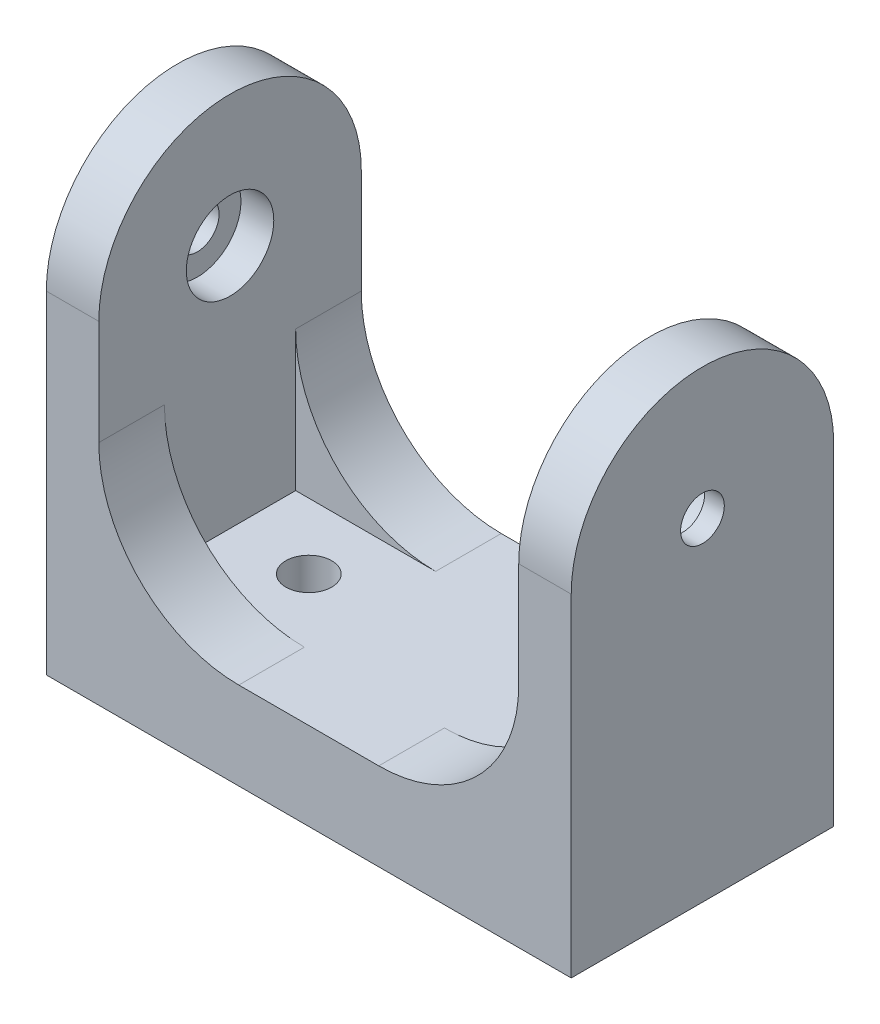
ISO-10303-21;
HEADER;
FILE_DESCRIPTION(('STEP AP214'),'2;1');
FILE_NAME('part.step','',(''),(''),'','','');
FILE_SCHEMA(('AUTOMOTIVE_DESIGN { 1 0 10303 214 1 1 1 1 }'));
ENDSEC;
DATA;
#1=APPLICATION_CONTEXT('core data for automotive mechanical design processes');
#2=APPLICATION_PROTOCOL_DEFINITION('international standard','automotive_design',2000,#1);
#3=PRODUCT_CONTEXT('',#1,'mechanical');
#4=PRODUCT('Part','Part','',(#3));
#5=PRODUCT_RELATED_PRODUCT_CATEGORY('part','',(#4));
#6=PRODUCT_DEFINITION_FORMATION('','',#4);
#7=PRODUCT_DEFINITION_CONTEXT('part definition',#1,'design');
#8=PRODUCT_DEFINITION('design','',#6,#7);
#9=PRODUCT_DEFINITION_SHAPE('','',#8);
#10=(LENGTH_UNIT() NAMED_UNIT(*) SI_UNIT(.MILLI.,.METRE.));
#11=(NAMED_UNIT(*) PLANE_ANGLE_UNIT() SI_UNIT($,.RADIAN.));
#12=(NAMED_UNIT(*) SI_UNIT($,.STERADIAN.) SOLID_ANGLE_UNIT());
#13=UNCERTAINTY_MEASURE_WITH_UNIT(LENGTH_MEASURE(1.E-05),#10,'distance_accuracy_value','');
#14=(GEOMETRIC_REPRESENTATION_CONTEXT(3) GLOBAL_UNCERTAINTY_ASSIGNED_CONTEXT((#13)) GLOBAL_UNIT_ASSIGNED_CONTEXT((#10,
#11,#12)) REPRESENTATION_CONTEXT('',''));
#15=CARTESIAN_POINT('',(0.,0.,0.));
#16=DIRECTION('',(0.,0.,1.));
#17=DIRECTION('',(1.,0.,0.));
#18=AXIS2_PLACEMENT_3D('',#15,#16,#17);
#19=CARTESIAN_POINT('',(68.58,48.26,-19.05));
#20=DIRECTION('',(1.,0.,0.));
#21=DIRECTION('',(0.,0.,-1.));
#22=AXIS2_PLACEMENT_3D('',#19,#20,#21);
#23=CYLINDRICAL_SURFACE('',#22,3.175);
#24=CARTESIAN_POINT('',(76.2,48.26,-19.05));
#25=DIRECTION('',(-1.,0.,0.));
#26=DIRECTION('',(0.,0.,1.));
#27=AXIS2_PLACEMENT_3D('',#24,#25,#26);
#28=CIRCLE('',#27,3.175);
#29=CARTESIAN_POINT('',(76.2000000000001,48.26,-22.225));
#30=VERTEX_POINT('',#29);
#31=EDGE_CURVE('E196',#30,#30,#28,.T.);
#32=CARTESIAN_POINT('',(73.3425,48.26,-19.05));
#33=DIRECTION('',(-1.,0.,0.));
#34=DIRECTION('',(0.,0.,1.));
#35=AXIS2_PLACEMENT_3D('',#32,#33,#34);
#36=CIRCLE('',#35,3.175);
#37=CARTESIAN_POINT('',(73.3425,48.26,-22.225));
#38=VERTEX_POINT('',#37);
#39=EDGE_CURVE('E45',#38,#38,#36,.T.);
#40=CARTESIAN_POINT('',(76.2000000000001,48.26,-22.225));
#41=CARTESIAN_POINT('',(76.1702343750001,48.26,-22.225));
#42=CARTESIAN_POINT('',(76.1404687500001,48.26,-22.225));
#43=CARTESIAN_POINT('',(76.0809375000001,48.26,-22.225));
#44=CARTESIAN_POINT('',(76.0511718750001,48.26,-22.225));
#45=CARTESIAN_POINT('',(75.991640625,48.26,-22.225));
#46=CARTESIAN_POINT('',(75.961875,48.26,-22.225));
#47=CARTESIAN_POINT('',(75.9023437500001,48.26,-22.225));
#48=CARTESIAN_POINT('',(75.872578125,48.26,-22.225));
#49=CARTESIAN_POINT('',(75.8130468750001,48.26,-22.225));
#50=CARTESIAN_POINT('',(75.7832812500001,48.26,-22.225));
#51=CARTESIAN_POINT('',(75.7237500000001,48.26,-22.225));
#52=CARTESIAN_POINT('',(75.6939843750001,48.26,-22.225));
#53=CARTESIAN_POINT('',(75.6344531250001,48.26,-22.225));
#54=CARTESIAN_POINT('',(75.6046875,48.26,-22.225));
#55=CARTESIAN_POINT('',(75.54515625,48.26,-22.225));
#56=CARTESIAN_POINT('',(75.5153906250001,48.26,-22.225));
#57=CARTESIAN_POINT('',(75.4558593750001,48.26,-22.225));
#58=CARTESIAN_POINT('',(75.42609375,48.26,-22.225));
#59=CARTESIAN_POINT('',(75.3665625000001,48.26,-22.225));
#60=CARTESIAN_POINT('',(75.3367968750001,48.26,-22.225));
#61=CARTESIAN_POINT('',(75.2772656250001,48.26,-22.225));
#62=CARTESIAN_POINT('',(75.2475,48.26,-22.225));
#63=CARTESIAN_POINT('',(75.1879687500001,48.26,-22.225));
#64=CARTESIAN_POINT('',(75.158203125,48.26,-22.225));
#65=CARTESIAN_POINT('',(75.0986718750001,48.26,-22.225));
#66=CARTESIAN_POINT('',(75.0689062500001,48.26,-22.225));
#67=CARTESIAN_POINT('',(75.0093750000001,48.26,-22.225));
#68=CARTESIAN_POINT('',(74.9796093750001,48.26,-22.225));
#69=CARTESIAN_POINT('',(74.920078125,48.26,-22.225));
#70=CARTESIAN_POINT('',(74.8903125000001,48.26,-22.225));
#71=CARTESIAN_POINT('',(74.8307812500001,48.26,-22.225));
#72=CARTESIAN_POINT('',(74.801015625,48.26,-22.225));
#73=CARTESIAN_POINT('',(74.7414843750001,48.26,-22.225));
#74=CARTESIAN_POINT('',(74.71171875,48.26,-22.225));
#75=CARTESIAN_POINT('',(74.6521875000001,48.26,-22.225));
#76=CARTESIAN_POINT('',(74.6224218750001,48.26,-22.225));
#77=CARTESIAN_POINT('',(74.5628906250001,48.26,-22.225));
#78=CARTESIAN_POINT('',(74.533125,48.26,-22.225));
#79=CARTESIAN_POINT('',(74.47359375,48.26,-22.225));
#80=CARTESIAN_POINT('',(74.4438281250001,48.26,-22.225));
#81=CARTESIAN_POINT('',(74.3842968750001,48.26,-22.225));
#82=CARTESIAN_POINT('',(74.3545312500001,48.26,-22.225));
#83=CARTESIAN_POINT('',(74.2950000000001,48.26,-22.225));
#84=CARTESIAN_POINT('',(74.265234375,48.26,-22.225));
#85=CARTESIAN_POINT('',(74.2057031250001,48.26,-22.225));
#86=CARTESIAN_POINT('',(74.1759375,48.26,-22.225));
#87=CARTESIAN_POINT('',(74.1164062500001,48.26,-22.225));
#88=CARTESIAN_POINT('',(74.086640625,48.26,-22.225));
#89=CARTESIAN_POINT('',(74.0271093750001,48.26,-22.225));
#90=CARTESIAN_POINT('',(73.9973437500001,48.26,-22.225));
#91=CARTESIAN_POINT('',(73.9378125000001,48.26,-22.225));
#92=CARTESIAN_POINT('',(73.9080468750001,48.26,-22.225));
#93=CARTESIAN_POINT('',(73.8485156250001,48.26,-22.225));
#94=CARTESIAN_POINT('',(73.8187500000001,48.26,-22.225));
#95=CARTESIAN_POINT('',(73.75921875,48.26,-22.225));
#96=CARTESIAN_POINT('',(73.729453125,48.26,-22.225));
#97=CARTESIAN_POINT('',(73.6699218750001,48.26,-22.225));
#98=CARTESIAN_POINT('',(73.64015625,48.26,-22.225));
#99=CARTESIAN_POINT('',(73.5806250000001,48.26,-22.225));
#100=CARTESIAN_POINT('',(73.5508593750001,48.26,-22.225));
#101=CARTESIAN_POINT('',(73.4913281250001,48.26,-22.225));
#102=CARTESIAN_POINT('',(73.4615625000001,48.26,-22.225));
#103=CARTESIAN_POINT('',(73.4020312500001,48.26,-22.225));
#104=CARTESIAN_POINT('',(73.372265625,48.26,-22.225));
#105=CARTESIAN_POINT('',(73.3425,48.26,-22.225));
#106=B_SPLINE_CURVE_WITH_KNOTS('',3,(#40,#41,#42,#43,#44,#45,#46,#47,#48,#49,#50,#51,#52,#53,
#54,#55,#56,#57,#58,#59,#60,#61,#62,#63,#64,#65,#66,#67,#68,#69,#70,#71,#72,#73,#74,#75,#76,#77,
#78,#79,#80,#81,#82,#83,#84,#85,#86,#87,#88,#89,#90,#91,#92,#93,#94,#95,#96,#97,#98,#99,#100,
#101,#102,#103,#104,#105),.UNSPECIFIED.,.F.,.F.,(4,2,2,2,2,2,2,2,2,2,2,2,2,2,2,2,2,2,2,2,2,2,2,
2,2,2,2,2,2,2,2,2,4),(0.,0.0892968750000056,0.178593750000011,0.267890625000003,
0.357187500000009,0.446484375,0.535781250000006,0.625078125000011,0.714375000000003,
0.803671875000009,0.892968750000001,0.982265625000006,1.07156250000001,1.160859375,
1.25015625000001,1.339453125,1.42875000000001,1.51804687500001,1.60734375,1.69664062500001,
1.7859375,1.87523437500001,1.96453125000001,2.053828125,2.14312500000001,2.232421875,
2.32171875000001,2.41101562500001,2.5003125,2.58960937500001,2.67890625,2.76820312500001,
2.85750000000001),.UNSPECIFIED.);
#107=EDGE_CURVE('BSEAM41',#30,#38,#106,.T.);
#108=ORIENTED_EDGE('',*,*,#31,.F.);
#109=ORIENTED_EDGE('',*,*,#39,.T.);
#110=ORIENTED_EDGE('',*,*,#107,.T.);
#111=ORIENTED_EDGE('',*,*,#107,.F.);
#112=EDGE_LOOP('',(#108,#110,#109,#111));
#113=FACE_BOUND('',#112,.T.);
#114=ADVANCED_FACE('F41',(#113),#23,.F.);
#115=CARTESIAN_POINT('',(57.15,12.7,-19.05));
#116=DIRECTION('',(0.,-1.,0.));
#117=DIRECTION('',(0.,0.,-1.));
#118=AXIS2_PLACEMENT_3D('',#115,#116,#117);
#119=CYLINDRICAL_SURFACE('',#118,3.3274);
#120=CARTESIAN_POINT('',(57.15,0.,-19.05));
#121=DIRECTION('',(0.,1.,0.));
#122=DIRECTION('',(0.,0.,-1.));
#123=AXIS2_PLACEMENT_3D('',#120,#121,#122);
#124=CIRCLE('',#123,3.3274);
#125=CARTESIAN_POINT('',(57.15,0.,-22.3774));
#126=VERTEX_POINT('',#125);
#127=EDGE_CURVE('E274',#126,#126,#124,.T.);
#128=ORIENTED_EDGE('',*,*,#127,.F.);
#129=EDGE_LOOP('',(#128));
#130=FACE_BOUND('',#129,.T.);
#131=CARTESIAN_POINT('',(57.15,12.7,-19.05));
#132=DIRECTION('',(0.,1.,0.));
#133=DIRECTION('',(0.,0.,1.));
#134=AXIS2_PLACEMENT_3D('',#131,#132,#133);
#135=CIRCLE('',#134,3.3274);
#136=CARTESIAN_POINT('',(57.15,12.7,-15.7226));
#137=VERTEX_POINT('',#136);
#138=EDGE_CURVE('E169',#137,#137,#135,.T.);
#139=ORIENTED_EDGE('',*,*,#138,.T.);
#140=EDGE_LOOP('',(#139));
#141=FACE_BOUND('',#140,.T.);
#142=ADVANCED_FACE('F403',(#130,#141),#119,.F.);
#143=CARTESIAN_POINT('',(48.26,33.02,-19.05));
#144=DIRECTION('',(0.,0.,-1.));
#145=DIRECTION('',(-1.,0.,0.));
#146=AXIS2_PLACEMENT_3D('',#143,#144,#145);
#147=CYLINDRICAL_SURFACE('',#146,20.32);
#148=DIRECTION('',(0.,0.,1.));
#149=VECTOR('',#148,1.);
#150=CARTESIAN_POINT('',(48.26,12.7,-38.1));
#151=LINE('',#150,#149);
#152=CARTESIAN_POINT('',(48.26,12.7,-28.575));
#153=VERTEX_POINT('',#152);
#154=CARTESIAN_POINT('',(48.26,12.7,-38.1));
#155=VERTEX_POINT('',#154);
#156=EDGE_CURVE('E350',#153,#155,#151,.F.);
#157=ORIENTED_EDGE('',*,*,#156,.F.);
#158=CARTESIAN_POINT('',(48.26,33.02,-28.575));
#159=DIRECTION('',(0.,0.,-1.));
#160=DIRECTION('',(-1.,0.,0.));
#161=AXIS2_PLACEMENT_3D('',#158,#159,#160);
#162=CIRCLE('',#161,20.32);
#163=CARTESIAN_POINT('',(68.58,33.02,-28.575));
#164=VERTEX_POINT('',#163);
#165=EDGE_CURVE('E11',#153,#164,#162,.F.);
#166=ORIENTED_EDGE('',*,*,#165,.T.);
#167=DIRECTION('',(0.,0.,1.));
#168=VECTOR('',#167,1.);
#169=CARTESIAN_POINT('',(68.58,33.02,0.));
#170=LINE('',#169,#168);
#171=CARTESIAN_POINT('',(68.58,33.02,-38.1));
#172=VERTEX_POINT('',#171);
#173=EDGE_CURVE('E166',#172,#164,#170,.T.);
#174=ORIENTED_EDGE('',*,*,#173,.F.);
#175=CARTESIAN_POINT('',(48.26,33.02,-38.1));
#176=DIRECTION('',(0.,0.,1.));
#177=DIRECTION('',(1.,0.,0.));
#178=AXIS2_PLACEMENT_3D('',#175,#176,#177);
#179=CIRCLE('',#178,20.32);
#180=EDGE_CURVE('E356',#155,#172,#179,.T.);
#181=ORIENTED_EDGE('',*,*,#180,.F.);
#182=EDGE_LOOP('',(#157,#166,#174,#181));
#183=FACE_BOUND('',#182,.T.);
#184=ADVANCED_FACE('F401',(#183),#147,.F.);
#185=CARTESIAN_POINT('',(0.,12.7,0.));
#186=DIRECTION('',(0.,-1.,0.));
#187=DIRECTION('',(0.,0.,-1.));
#188=AXIS2_PLACEMENT_3D('',#185,#186,#187);
#189=PLANE('',#188);
#190=DIRECTION('',(1.,0.,0.));
#191=VECTOR('',#190,1.);
#192=CARTESIAN_POINT('',(68.58,12.7,-28.575));
#193=LINE('',#192,#191);
#194=CARTESIAN_POINT('',(68.58,12.7,-28.575));
#195=VERTEX_POINT('',#194);
#196=EDGE_CURVE('E58',#153,#195,#193,.T.);
#197=ORIENTED_EDGE('',*,*,#196,.F.);
#198=ORIENTED_EDGE('',*,*,#156,.T.);
#199=DIRECTION('',(-1.,0.,0.));
#200=VECTOR('',#199,1.);
#201=CARTESIAN_POINT('',(0.,12.7,-38.1));
#202=LINE('',#201,#200);
#203=CARTESIAN_POINT('',(27.94,12.7,-38.1));
#204=VERTEX_POINT('',#203);
#205=EDGE_CURVE('E289',#155,#204,#202,.T.);
#206=ORIENTED_EDGE('',*,*,#205,.T.);
#207=DIRECTION('',(0.,0.,1.));
#208=VECTOR('',#207,1.);
#209=CARTESIAN_POINT('',(27.94,12.7,0.));
#210=LINE('',#209,#208);
#211=CARTESIAN_POINT('',(27.94,12.7,-28.575));
#212=VERTEX_POINT('',#211);
#213=EDGE_CURVE('E321',#204,#212,#210,.T.);
#214=ORIENTED_EDGE('',*,*,#213,.T.);
#215=DIRECTION('',(-1.,0.,0.));
#216=VECTOR('',#215,1.);
#217=CARTESIAN_POINT('',(7.62,12.7,-28.575));
#218=LINE('',#217,#216);
#219=CARTESIAN_POINT('',(7.62,12.7,-28.575));
#220=VERTEX_POINT('',#219);
#221=EDGE_CURVE('E237',#212,#220,#218,.T.);
#222=ORIENTED_EDGE('',*,*,#221,.T.);
#223=DIRECTION('',(0.,0.,1.));
#224=VECTOR('',#223,1.);
#225=CARTESIAN_POINT('',(7.62,12.7,-28.575));
#226=LINE('',#225,#224);
#227=CARTESIAN_POINT('',(7.62,12.7,-9.525));
#228=VERTEX_POINT('',#227);
#229=EDGE_CURVE('E230',#220,#228,#226,.T.);
#230=ORIENTED_EDGE('',*,*,#229,.T.);
#231=DIRECTION('',(1.,0.,0.));
#232=VECTOR('',#231,1.);
#233=CARTESIAN_POINT('',(7.62,12.7,-9.525));
#234=LINE('',#233,#232);
#235=CARTESIAN_POINT('',(27.94,12.7,-9.525));
#236=VERTEX_POINT('',#235);
#237=EDGE_CURVE('E234',#228,#236,#234,.T.);
#238=ORIENTED_EDGE('',*,*,#237,.T.);
#239=CARTESIAN_POINT('',(27.94,12.7,0.));
#240=VERTEX_POINT('',#239);
#241=EDGE_CURVE('E320',#236,#240,#210,.T.);
#242=ORIENTED_EDGE('',*,*,#241,.T.);
#243=DIRECTION('',(1.,0.,0.));
#244=VECTOR('',#243,1.);
#245=CARTESIAN_POINT('',(0.,12.7,0.));
#246=LINE('',#245,#244);
#247=CARTESIAN_POINT('',(48.26,12.7,0.));
#248=VERTEX_POINT('',#247);
#249=EDGE_CURVE('E286',#240,#248,#246,.T.);
#250=ORIENTED_EDGE('',*,*,#249,.T.);
#251=CARTESIAN_POINT('',(48.26,12.7,-9.525));
#252=VERTEX_POINT('',#251);
#253=EDGE_CURVE('E351',#248,#252,#151,.F.);
#254=ORIENTED_EDGE('',*,*,#253,.T.);
#255=DIRECTION('',(-1.,0.,0.));
#256=VECTOR('',#255,1.);
#257=CARTESIAN_POINT('',(68.58,12.7,-9.525));
#258=LINE('',#257,#256);
#259=CARTESIAN_POINT('',(68.58,12.7,-9.525));
#260=VERTEX_POINT('',#259);
#261=EDGE_CURVE('E175',#260,#252,#258,.T.);
#262=ORIENTED_EDGE('',*,*,#261,.F.);
#263=DIRECTION('',(0.,0.,1.));
#264=VECTOR('',#263,1.);
#265=CARTESIAN_POINT('',(68.58,12.7,-28.575));
#266=LINE('',#265,#264);
#267=EDGE_CURVE('E162',#195,#260,#266,.T.);
#268=ORIENTED_EDGE('',*,*,#267,.F.);
#269=EDGE_LOOP('',(#197,#198,#206,#214,#222,#230,#238,#242,#250,#254,#262,#268));
#270=FACE_BOUND('',#269,.T.);
#271=CARTESIAN_POINT('',(19.05,12.7,-19.05));
#272=DIRECTION('',(0.,1.,0.));
#273=DIRECTION('',(0.,0.,1.));
#274=AXIS2_PLACEMENT_3D('',#271,#272,#273);
#275=CIRCLE('',#274,3.3274);
#276=CARTESIAN_POINT('',(19.05,12.7,-15.7226));
#277=VERTEX_POINT('',#276);
#278=EDGE_CURVE('E247',#277,#277,#275,.T.);
#279=ORIENTED_EDGE('',*,*,#278,.F.);
#280=EDGE_LOOP('',(#279));
#281=FACE_BOUND('',#280,.T.);
#282=ORIENTED_EDGE('',*,*,#138,.F.);
#283=EDGE_LOOP('',(#282));
#284=FACE_BOUND('',#283,.T.);
#285=ADVANCED_FACE('F177',(#270,#281,#284),#189,.F.);
#286=CARTESIAN_POINT('',(7.62,48.26,-19.05));
#287=DIRECTION('',(-1.,0.,0.));
#288=DIRECTION('',(0.,0.,1.));
#289=AXIS2_PLACEMENT_3D('',#286,#287,#288);
#290=CYLINDRICAL_SURFACE('',#289,3.175);
#291=CARTESIAN_POINT('',(0.,48.26,-19.05));
#292=DIRECTION('',(-1.,0.,0.));
#293=DIRECTION('',(0.,0.,1.));
#294=AXIS2_PLACEMENT_3D('',#291,#292,#293);
#295=CIRCLE('',#294,3.175);
#296=CARTESIAN_POINT('',(0.,48.26,-15.875));
#297=VERTEX_POINT('',#296);
#298=EDGE_CURVE('E251',#297,#297,#295,.T.);
#299=CARTESIAN_POINT('',(2.8575,48.26,-19.05));
#300=DIRECTION('',(1.,0.,0.));
#301=DIRECTION('',(0.,0.,-1.));
#302=AXIS2_PLACEMENT_3D('',#299,#300,#301);
#303=CIRCLE('',#302,3.175);
#304=CARTESIAN_POINT('',(2.8575,48.26,-15.875));
#305=VERTEX_POINT('',#304);
#306=EDGE_CURVE('E226',#305,#305,#303,.F.);
#307=CARTESIAN_POINT('',(0.,48.26,-15.875));
#308=CARTESIAN_POINT('',(0.0297656250000001,48.26,-15.875));
#309=CARTESIAN_POINT('',(0.0595312500000003,48.26,-15.875));
#310=CARTESIAN_POINT('',(0.1190625,48.26,-15.875));
#311=CARTESIAN_POINT('',(0.148828125,48.26,-15.875));
#312=CARTESIAN_POINT('',(0.208359375,48.26,-15.875));
#313=CARTESIAN_POINT('',(0.238125,48.26,-15.875));
#314=CARTESIAN_POINT('',(0.29765625,48.26,-15.875));
#315=CARTESIAN_POINT('',(0.327421875,48.26,-15.875));
#316=CARTESIAN_POINT('',(0.386953125,48.26,-15.875));
#317=CARTESIAN_POINT('',(0.41671875,48.26,-15.875));
#318=CARTESIAN_POINT('',(0.47625,48.26,-15.875));
#319=CARTESIAN_POINT('',(0.506015625,48.26,-15.875));
#320=CARTESIAN_POINT('',(0.565546875,48.26,-15.875));
#321=CARTESIAN_POINT('',(0.595312499999999,48.26,-15.875));
#322=CARTESIAN_POINT('',(0.65484375,48.26,-15.875));
#323=CARTESIAN_POINT('',(0.684609375,48.26,-15.875));
#324=CARTESIAN_POINT('',(0.744140625,48.26,-15.875));
#325=CARTESIAN_POINT('',(0.77390625,48.26,-15.875));
#326=CARTESIAN_POINT('',(0.8334375,48.26,-15.875));
#327=CARTESIAN_POINT('',(0.863203125,48.26,-15.875));
#328=CARTESIAN_POINT('',(0.922734375,48.26,-15.875));
#329=CARTESIAN_POINT('',(0.952499999999999,48.26,-15.875));
#330=CARTESIAN_POINT('',(1.01203125,48.26,-15.875));
#331=CARTESIAN_POINT('',(1.041796875,48.26,-15.875));
#332=CARTESIAN_POINT('',(1.101328125,48.26,-15.875));
#333=CARTESIAN_POINT('',(1.13109375,48.26,-15.875));
#334=CARTESIAN_POINT('',(1.190625,48.26,-15.875));
#335=CARTESIAN_POINT('',(1.220390625,48.26,-15.875));
#336=CARTESIAN_POINT('',(1.279921875,48.26,-15.875));
#337=CARTESIAN_POINT('',(1.3096875,48.26,-15.875));
#338=CARTESIAN_POINT('',(1.36921875,48.26,-15.875));
#339=CARTESIAN_POINT('',(1.398984375,48.26,-15.875));
#340=CARTESIAN_POINT('',(1.458515625,48.26,-15.875));
#341=CARTESIAN_POINT('',(1.48828125,48.26,-15.875));
#342=CARTESIAN_POINT('',(1.5478125,48.26,-15.875));
#343=CARTESIAN_POINT('',(1.577578125,48.26,-15.875));
#344=CARTESIAN_POINT('',(1.637109375,48.26,-15.875));
#345=CARTESIAN_POINT('',(1.666875,48.26,-15.875));
#346=CARTESIAN_POINT('',(1.72640625,48.26,-15.875));
#347=CARTESIAN_POINT('',(1.756171875,48.26,-15.875));
#348=CARTESIAN_POINT('',(1.815703125,48.26,-15.875));
#349=CARTESIAN_POINT('',(1.84546875,48.26,-15.875));
#350=CARTESIAN_POINT('',(1.905,48.26,-15.875));
#351=CARTESIAN_POINT('',(1.934765625,48.26,-15.875));
#352=CARTESIAN_POINT('',(1.994296875,48.26,-15.875));
#353=CARTESIAN_POINT('',(2.0240625,48.26,-15.875));
#354=CARTESIAN_POINT('',(2.08359375,48.26,-15.875));
#355=CARTESIAN_POINT('',(2.113359375,48.26,-15.875));
#356=CARTESIAN_POINT('',(2.172890625,48.26,-15.875));
#357=CARTESIAN_POINT('',(2.20265625,48.26,-15.875));
#358=CARTESIAN_POINT('',(2.2621875,48.26,-15.875));
#359=CARTESIAN_POINT('',(2.291953125,48.26,-15.875));
#360=CARTESIAN_POINT('',(2.351484375,48.26,-15.875));
#361=CARTESIAN_POINT('',(2.38125,48.26,-15.875));
#362=CARTESIAN_POINT('',(2.44078125,48.26,-15.875));
#363=CARTESIAN_POINT('',(2.470546875,48.26,-15.875));
#364=CARTESIAN_POINT('',(2.530078125,48.26,-15.875));
#365=CARTESIAN_POINT('',(2.55984375,48.26,-15.875));
#366=CARTESIAN_POINT('',(2.619375,48.26,-15.875));
#367=CARTESIAN_POINT('',(2.649140625,48.26,-15.875));
#368=CARTESIAN_POINT('',(2.708671875,48.26,-15.875));
#369=CARTESIAN_POINT('',(2.7384375,48.26,-15.875));
#370=CARTESIAN_POINT('',(2.79796875,48.26,-15.875));
#371=CARTESIAN_POINT('',(2.827734375,48.26,-15.875));
#372=CARTESIAN_POINT('',(2.8575,48.26,-15.875));
#373=B_SPLINE_CURVE_WITH_KNOTS('',3,(#307,#308,#309,#310,#311,#312,#313,#314,#315,#316,#317,
#318,#319,#320,#321,#322,#323,#324,#325,#326,#327,#328,#329,#330,#331,#332,#333,#334,#335,#336,
#337,#338,#339,#340,#341,#342,#343,#344,#345,#346,#347,#348,#349,#350,#351,#352,#353,#354,#355,
#356,#357,#358,#359,#360,#361,#362,#363,#364,#365,#366,#367,#368,#369,#370,#371,#372),
.UNSPECIFIED.,.F.,.F.,(4,2,2,2,2,2,2,2,2,2,2,2,2,2,2,2,2,2,2,2,2,2,2,2,2,2,2,2,2,2,2,2,4),(0.,
0.0892968750000004,0.17859375,0.267890624999999,0.3571875,0.446484375,0.53578125,
0.625078124999999,0.714375,0.803671875,0.89296875,0.982265624999999,1.0715625,1.160859375,
1.25015625,1.339453125,1.42875,1.518046875,1.60734375,1.696640625,1.7859375,1.875234375,
1.96453125,2.053828125,2.143125,2.232421875,2.32171875,2.411015625,2.5003125,2.589609375,
2.67890625,2.768203125,2.8575),.UNSPECIFIED.);
#374=EDGE_CURVE('BSEAM408',#297,#305,#373,.T.);
#375=ORIENTED_EDGE('',*,*,#298,.T.);
#376=ORIENTED_EDGE('',*,*,#306,.F.);
#377=ORIENTED_EDGE('',*,*,#374,.T.);
#378=ORIENTED_EDGE('',*,*,#374,.F.);
#379=EDGE_LOOP('',(#375,#377,#376,#378));
#380=FACE_BOUND('',#379,.T.);
#381=ADVANCED_FACE('F408',(#380),#290,.F.);
#382=CARTESIAN_POINT('',(19.05,12.7,-19.05));
#383=DIRECTION('',(0.,-1.,0.));
#384=DIRECTION('',(0.,0.,-1.));
#385=AXIS2_PLACEMENT_3D('',#382,#383,#384);
#386=CYLINDRICAL_SURFACE('',#385,3.3274);
#387=CARTESIAN_POINT('',(19.05,0.,-19.05));
#388=DIRECTION('',(0.,1.,0.));
#389=DIRECTION('',(0.,0.,1.));
#390=AXIS2_PLACEMENT_3D('',#387,#388,#389);
#391=CIRCLE('',#390,3.3274);
#392=CARTESIAN_POINT('',(19.05,0.,-15.7226));
#393=VERTEX_POINT('',#392);
#394=EDGE_CURVE('E281',#393,#393,#391,.T.);
#395=ORIENTED_EDGE('',*,*,#394,.F.);
#396=EDGE_LOOP('',(#395));
#397=FACE_BOUND('',#396,.T.);
#398=ORIENTED_EDGE('',*,*,#278,.T.);
#399=EDGE_LOOP('',(#398));
#400=FACE_BOUND('',#399,.T.);
#401=ADVANCED_FACE('F444',(#397,#400),#386,.F.);
#402=CARTESIAN_POINT('',(27.94,33.02,0.));
#403=DIRECTION('',(0.,0.,-1.));
#404=DIRECTION('',(-1.,0.,0.));
#405=AXIS2_PLACEMENT_3D('',#402,#403,#404);
#406=CYLINDRICAL_SURFACE('',#405,20.32);
#407=CARTESIAN_POINT('',(27.94,33.02,-9.525));
#408=DIRECTION('',(0.,0.,-1.));
#409=DIRECTION('',(-1.,0.,0.));
#410=AXIS2_PLACEMENT_3D('',#407,#408,#409);
#411=CIRCLE('',#410,20.32);
#412=CARTESIAN_POINT('',(7.62000000000001,33.02,-9.525));
#413=VERTEX_POINT('',#412);
#414=EDGE_CURVE('E340',#413,#236,#411,.F.);
#415=ORIENTED_EDGE('',*,*,#414,.F.);
#416=DIRECTION('',(0.,0.,1.));
#417=VECTOR('',#416,1.);
#418=CARTESIAN_POINT('',(7.62,33.02,-38.1));
#419=LINE('',#418,#417);
#420=CARTESIAN_POINT('',(7.62,33.02,0.));
#421=VERTEX_POINT('',#420);
#422=EDGE_CURVE('E326',#421,#413,#419,.F.);
#423=ORIENTED_EDGE('',*,*,#422,.F.);
#424=CARTESIAN_POINT('',(27.94,33.02,0.));
#425=DIRECTION('',(0.,0.,-1.));
#426=DIRECTION('',(-1.,0.,0.));
#427=AXIS2_PLACEMENT_3D('',#424,#425,#426);
#428=CIRCLE('',#427,20.32);
#429=EDGE_CURVE('E330',#240,#421,#428,.T.);
#430=ORIENTED_EDGE('',*,*,#429,.F.);
#431=ORIENTED_EDGE('',*,*,#241,.F.);
#432=EDGE_LOOP('',(#415,#423,#430,#431));
#433=FACE_BOUND('',#432,.T.);
#434=ADVANCED_FACE('F377',(#433),#406,.F.);
#435=CARTESIAN_POINT('',(27.94,33.02,-28.575));
#436=DIRECTION('',(0.,0.,1.));
#437=DIRECTION('',(1.,0.,0.));
#438=AXIS2_PLACEMENT_3D('',#435,#436,#437);
#439=CIRCLE('',#438,20.32);
#440=CARTESIAN_POINT('',(7.62000000000001,33.02,-28.575));
#441=VERTEX_POINT('',#440);
#442=EDGE_CURVE('E337',#212,#441,#439,.F.);
#443=ORIENTED_EDGE('',*,*,#442,.F.);
#444=ORIENTED_EDGE('',*,*,#213,.F.);
#445=CARTESIAN_POINT('',(27.94,33.02,-38.1));
#446=DIRECTION('',(0.,0.,1.));
#447=DIRECTION('',(1.,0.,0.));
#448=AXIS2_PLACEMENT_3D('',#445,#446,#447);
#449=CIRCLE('',#448,20.32);
#450=CARTESIAN_POINT('',(7.62,33.02,-38.1));
#451=VERTEX_POINT('',#450);
#452=EDGE_CURVE('E333',#451,#204,#449,.T.);
#453=ORIENTED_EDGE('',*,*,#452,.F.);
#454=EDGE_CURVE('E325',#441,#451,#419,.F.);
#455=ORIENTED_EDGE('',*,*,#454,.F.);
#456=EDGE_LOOP('',(#443,#444,#453,#455));
#457=FACE_BOUND('',#456,.T.);
#458=ADVANCED_FACE('F389',(#457),#406,.F.);
#459=CARTESIAN_POINT('',(0.,0.,0.));
#460=DIRECTION('',(0.,-1.,0.));
#461=DIRECTION('',(0.,0.,-1.));
#462=AXIS2_PLACEMENT_3D('',#459,#460,#461);
#463=PLANE('',#462);
#464=ORIENTED_EDGE('',*,*,#394,.T.);
#465=EDGE_LOOP('',(#464));
#466=FACE_BOUND('',#465,.T.);
#467=DIRECTION('',(0.,0.,1.));
#468=VECTOR('',#467,1.);
#469=CARTESIAN_POINT('',(0.,0.,0.));
#470=LINE('',#469,#468);
#471=CARTESIAN_POINT('',(0.,0.,-38.1));
#472=VERTEX_POINT('',#471);
#473=CARTESIAN_POINT('',(0.,0.,0.));
#474=VERTEX_POINT('',#473);
#475=EDGE_CURVE('E285',#472,#474,#470,.T.);
#476=ORIENTED_EDGE('',*,*,#475,.F.);
#477=DIRECTION('',(-1.,0.,0.));
#478=VECTOR('',#477,1.);
#479=CARTESIAN_POINT('',(0.,0.,-38.1));
#480=LINE('',#479,#478);
#481=CARTESIAN_POINT('',(76.2,0.,-38.1));
#482=VERTEX_POINT('',#481);
#483=EDGE_CURVE('E290',#482,#472,#480,.T.);
#484=ORIENTED_EDGE('',*,*,#483,.F.);
#485=DIRECTION('',(0.,0.,-1.));
#486=VECTOR('',#485,1.);
#487=CARTESIAN_POINT('',(76.2,0.,0.));
#488=LINE('',#487,#486);
#489=CARTESIAN_POINT('',(76.2,0.,0.));
#490=VERTEX_POINT('',#489);
#491=EDGE_CURVE('E300',#490,#482,#488,.T.);
#492=ORIENTED_EDGE('',*,*,#491,.F.);
#493=DIRECTION('',(1.,0.,0.));
#494=VECTOR('',#493,1.);
#495=CARTESIAN_POINT('',(0.,0.,0.));
#496=LINE('',#495,#494);
#497=EDGE_CURVE('E297',#474,#490,#496,.T.);
#498=ORIENTED_EDGE('',*,*,#497,.F.);
#499=EDGE_LOOP('',(#476,#484,#492,#498));
#500=FACE_BOUND('',#499,.T.);
#501=ORIENTED_EDGE('',*,*,#127,.T.);
#502=EDGE_LOOP('',(#501));
#503=FACE_BOUND('',#502,.T.);
#504=ADVANCED_FACE('F456',(#466,#500,#503),#463,.T.);
#505=CARTESIAN_POINT('',(0.,12.7,0.));
#506=DIRECTION('',(1.,0.,0.));
#507=DIRECTION('',(0.,0.,-1.));
#508=AXIS2_PLACEMENT_3D('',#505,#506,#507);
#509=PLANE('',#508);
#510=ORIENTED_EDGE('',*,*,#475,.T.);
#511=DIRECTION('',(0.,-1.,0.));
#512=VECTOR('',#511,1.);
#513=CARTESIAN_POINT('',(0.,12.7,0.));
#514=LINE('',#513,#512);
#515=CARTESIAN_POINT('',(0.,48.26,0.));
#516=VERTEX_POINT('',#515);
#517=EDGE_CURVE('E316',#516,#474,#514,.T.);
#518=ORIENTED_EDGE('',*,*,#517,.F.);
#519=CARTESIAN_POINT('',(0.,48.26,-19.05));
#520=DIRECTION('',(-1.,0.,0.));
#521=DIRECTION('',(0.,0.,1.));
#522=AXIS2_PLACEMENT_3D('',#519,#520,#521);
#523=CIRCLE('',#522,19.05);
#524=CARTESIAN_POINT('',(0.,48.26,-38.1));
#525=VERTEX_POINT('',#524);
#526=EDGE_CURVE('E255',#516,#525,#523,.T.);
#527=ORIENTED_EDGE('',*,*,#526,.T.);
#528=DIRECTION('',(0.,-1.,0.));
#529=VECTOR('',#528,1.);
#530=CARTESIAN_POINT('',(0.,12.7,-38.1));
#531=LINE('',#530,#529);
#532=EDGE_CURVE('E293',#525,#472,#531,.T.);
#533=ORIENTED_EDGE('',*,*,#532,.T.);
#534=EDGE_LOOP('',(#510,#518,#527,#533));
#535=FACE_BOUND('',#534,.T.);
#536=ORIENTED_EDGE('',*,*,#298,.F.);
#537=EDGE_LOOP('',(#536));
#538=FACE_BOUND('',#537,.T.);
#539=ADVANCED_FACE('F459',(#535,#538),#509,.F.);
#540=CARTESIAN_POINT('',(0.,12.7,0.));
#541=DIRECTION('',(0.,0.,-1.));
#542=DIRECTION('',(-1.,0.,0.));
#543=AXIS2_PLACEMENT_3D('',#540,#541,#542);
#544=PLANE('',#543);
#545=ORIENTED_EDGE('',*,*,#497,.T.);
#546=DIRECTION('',(0.,-1.,0.));
#547=VECTOR('',#546,1.);
#548=CARTESIAN_POINT('',(76.2,12.7,0.));
#549=LINE('',#548,#547);
#550=CARTESIAN_POINT('',(76.2,48.26,0.));
#551=VERTEX_POINT('',#550);
#552=EDGE_CURVE('E312',#551,#490,#549,.T.);
#553=ORIENTED_EDGE('',*,*,#552,.F.);
#554=DIRECTION('',(1.,0.,0.));
#555=VECTOR('',#554,1.);
#556=CARTESIAN_POINT('',(68.58,48.26,0.));
#557=LINE('',#556,#555);
#558=CARTESIAN_POINT('',(68.58,48.26,0.));
#559=VERTEX_POINT('',#558);
#560=EDGE_CURVE('E214',#559,#551,#557,.T.);
#561=ORIENTED_EDGE('',*,*,#560,.F.);
#562=DIRECTION('',(0.,1.,0.));
#563=VECTOR('',#562,1.);
#564=CARTESIAN_POINT('',(68.58,12.7,0.));
#565=LINE('',#564,#563);
#566=CARTESIAN_POINT('',(68.58,33.02,0.));
#567=VERTEX_POINT('',#566);
#568=EDGE_CURVE('E207',#567,#559,#565,.T.);
#569=ORIENTED_EDGE('',*,*,#568,.F.);
#570=CARTESIAN_POINT('',(48.26,33.02,0.));
#571=DIRECTION('',(0.,0.,-1.));
#572=DIRECTION('',(-1.,0.,0.));
#573=AXIS2_PLACEMENT_3D('',#570,#571,#572);
#574=CIRCLE('',#573,20.32);
#575=EDGE_CURVE('E66',#567,#248,#574,.T.);
#576=ORIENTED_EDGE('',*,*,#575,.T.);
#577=ORIENTED_EDGE('',*,*,#249,.F.);
#578=ORIENTED_EDGE('',*,*,#429,.T.);
#579=DIRECTION('',(0.,1.,0.));
#580=VECTOR('',#579,1.);
#581=CARTESIAN_POINT('',(7.62,12.7,0.));
#582=LINE('',#581,#580);
#583=CARTESIAN_POINT('',(7.62,48.26,0.));
#584=VERTEX_POINT('',#583);
#585=EDGE_CURVE('E260',#421,#584,#582,.T.);
#586=ORIENTED_EDGE('',*,*,#585,.T.);
#587=DIRECTION('',(-1.,0.,0.));
#588=VECTOR('',#587,1.);
#589=CARTESIAN_POINT('',(7.62,48.26,0.));
#590=LINE('',#589,#588);
#591=EDGE_CURVE('E266',#584,#516,#590,.T.);
#592=ORIENTED_EDGE('',*,*,#591,.T.);
#593=ORIENTED_EDGE('',*,*,#517,.T.);
#594=EDGE_LOOP('',(#545,#553,#561,#569,#576,#577,#578,#586,#592,#593));
#595=FACE_BOUND('',#594,.T.);
#596=ADVANCED_FACE('F367',(#595),#544,.F.);
#597=CARTESIAN_POINT('',(76.2,12.7,0.));
#598=DIRECTION('',(-1.,0.,0.));
#599=DIRECTION('',(0.,0.,1.));
#600=AXIS2_PLACEMENT_3D('',#597,#598,#599);
#601=PLANE('',#600);
#602=ORIENTED_EDGE('',*,*,#491,.T.);
#603=DIRECTION('',(0.,-1.,0.));
#604=VECTOR('',#603,1.);
#605=CARTESIAN_POINT('',(76.2,12.7,-38.1));
#606=LINE('',#605,#604);
#607=CARTESIAN_POINT('',(76.2,48.26,-38.1));
#608=VERTEX_POINT('',#607);
#609=EDGE_CURVE('E308',#608,#482,#606,.T.);
#610=ORIENTED_EDGE('',*,*,#609,.F.);
#611=CARTESIAN_POINT('',(76.2,48.26,-19.05));
#612=DIRECTION('',(-1.,0.,0.));
#613=DIRECTION('',(0.,0.,1.));
#614=AXIS2_PLACEMENT_3D('',#611,#612,#613);
#615=CIRCLE('',#614,19.05);
#616=EDGE_CURVE('E200',#551,#608,#615,.T.);
#617=ORIENTED_EDGE('',*,*,#616,.F.);
#618=ORIENTED_EDGE('',*,*,#552,.T.);
#619=EDGE_LOOP('',(#602,#610,#617,#618));
#620=FACE_BOUND('',#619,.T.);
#621=ORIENTED_EDGE('',*,*,#31,.T.);
#622=EDGE_LOOP('',(#621));
#623=FACE_BOUND('',#622,.T.);
#624=ADVANCED_FACE('F463',(#620,#623),#601,.F.);
#625=CARTESIAN_POINT('',(0.,12.7,-38.1));
#626=DIRECTION('',(0.,0.,1.));
#627=DIRECTION('',(1.,0.,0.));
#628=AXIS2_PLACEMENT_3D('',#625,#626,#627);
#629=PLANE('',#628);
#630=ORIENTED_EDGE('',*,*,#483,.T.);
#631=ORIENTED_EDGE('',*,*,#532,.F.);
#632=DIRECTION('',(-1.,0.,0.));
#633=VECTOR('',#632,1.);
#634=CARTESIAN_POINT('',(7.62,48.26,-38.1));
#635=LINE('',#634,#633);
#636=CARTESIAN_POINT('',(7.62,48.26,-38.1));
#637=VERTEX_POINT('',#636);
#638=EDGE_CURVE('E270',#637,#525,#635,.T.);
#639=ORIENTED_EDGE('',*,*,#638,.F.);
#640=DIRECTION('',(0.,-1.,0.));
#641=VECTOR('',#640,1.);
#642=CARTESIAN_POINT('',(7.62,12.7,-38.1));
#643=LINE('',#642,#641);
#644=EDGE_CURVE('E256',#637,#451,#643,.T.);
#645=ORIENTED_EDGE('',*,*,#644,.T.);
#646=ORIENTED_EDGE('',*,*,#452,.T.);
#647=ORIENTED_EDGE('',*,*,#205,.F.);
#648=ORIENTED_EDGE('',*,*,#180,.T.);
#649=DIRECTION('',(0.,-1.,0.));
#650=VECTOR('',#649,1.);
#651=CARTESIAN_POINT('',(68.58,12.7,-38.1));
#652=LINE('',#651,#650);
#653=CARTESIAN_POINT('',(68.58,48.26,-38.1));
#654=VERTEX_POINT('',#653);
#655=EDGE_CURVE('E201',#654,#172,#652,.T.);
#656=ORIENTED_EDGE('',*,*,#655,.F.);
#657=DIRECTION('',(1.,0.,0.));
#658=VECTOR('',#657,1.);
#659=CARTESIAN_POINT('',(68.58,48.26,-38.1));
#660=LINE('',#659,#658);
#661=EDGE_CURVE('E210',#654,#608,#660,.T.);
#662=ORIENTED_EDGE('',*,*,#661,.T.);
#663=ORIENTED_EDGE('',*,*,#609,.T.);
#664=EDGE_LOOP('',(#630,#631,#639,#645,#646,#647,#648,#656,#662,#663));
#665=FACE_BOUND('',#664,.T.);
#666=ADVANCED_FACE('F399',(#665),#629,.F.);
#667=CARTESIAN_POINT('',(7.62,48.26,-19.05));
#668=DIRECTION('',(-1.,0.,0.));
#669=DIRECTION('',(0.,0.,1.));
#670=AXIS2_PLACEMENT_3D('',#667,#668,#669);
#671=CYLINDRICAL_SURFACE('',#670,19.05);
#672=ORIENTED_EDGE('',*,*,#526,.F.);
#673=ORIENTED_EDGE('',*,*,#591,.F.);
#674=CARTESIAN_POINT('',(7.62,48.26,-19.05));
#675=DIRECTION('',(-1.,0.,0.));
#676=DIRECTION('',(0.,0.,1.));
#677=AXIS2_PLACEMENT_3D('',#674,#675,#676);
#678=CIRCLE('',#677,19.05);
#679=EDGE_CURVE('E263',#584,#637,#678,.T.);
#680=ORIENTED_EDGE('',*,*,#679,.T.);
#681=ORIENTED_EDGE('',*,*,#638,.T.);
#682=EDGE_LOOP('',(#672,#673,#680,#681));
#683=FACE_BOUND('',#682,.T.);
#684=ADVANCED_FACE('F448',(#683),#671,.T.);
#685=CARTESIAN_POINT('',(7.62,48.26,-19.05));
#686=DIRECTION('',(-1.,0.,0.));
#687=DIRECTION('',(0.,0.,1.));
#688=AXIS2_PLACEMENT_3D('',#685,#686,#687);
#689=PLANE('',#688);
#690=CARTESIAN_POINT('',(7.62,48.26,-19.05));
#691=DIRECTION('',(1.,0.,0.));
#692=DIRECTION('',(0.,0.,-1.));
#693=AXIS2_PLACEMENT_3D('',#690,#691,#692);
#694=CIRCLE('',#693,6.35);
#695=CARTESIAN_POINT('',(7.62,48.26,-25.4));
#696=VERTEX_POINT('',#695);
#697=EDGE_CURVE('E218',#696,#696,#694,.T.);
#698=ORIENTED_EDGE('',*,*,#697,.F.);
#699=EDGE_LOOP('',(#698));
#700=FACE_BOUND('',#699,.T.);
#701=ORIENTED_EDGE('',*,*,#644,.F.);
#702=ORIENTED_EDGE('',*,*,#679,.F.);
#703=ORIENTED_EDGE('',*,*,#585,.F.);
#704=ORIENTED_EDGE('',*,*,#422,.T.);
#705=DIRECTION('',(0.,-1.,0.));
#706=VECTOR('',#705,1.);
#707=CARTESIAN_POINT('',(7.62,67.31,-9.525));
#708=LINE('',#707,#706);
#709=EDGE_CURVE('E244',#413,#228,#708,.T.);
#710=ORIENTED_EDGE('',*,*,#709,.T.);
#711=ORIENTED_EDGE('',*,*,#229,.F.);
#712=DIRECTION('',(0.,-1.,0.));
#713=VECTOR('',#712,1.);
#714=CARTESIAN_POINT('',(7.62,67.31,-28.575));
#715=LINE('',#714,#713);
#716=EDGE_CURVE('E241',#441,#220,#715,.T.);
#717=ORIENTED_EDGE('',*,*,#716,.F.);
#718=ORIENTED_EDGE('',*,*,#454,.T.);
#719=EDGE_LOOP('',(#701,#702,#703,#704,#710,#711,#717,#718));
#720=FACE_BOUND('',#719,.T.);
#721=ADVANCED_FACE('F375',(#700,#720),#689,.F.);
#722=CARTESIAN_POINT('',(7.62,67.31,-9.525));
#723=DIRECTION('',(0.,0.,-1.));
#724=DIRECTION('',(-1.,0.,0.));
#725=AXIS2_PLACEMENT_3D('',#722,#723,#724);
#726=PLANE('',#725);
#727=ORIENTED_EDGE('',*,*,#414,.T.);
#728=ORIENTED_EDGE('',*,*,#237,.F.);
#729=ORIENTED_EDGE('',*,*,#709,.F.);
#730=EDGE_LOOP('',(#727,#728,#729));
#731=FACE_BOUND('',#730,.T.);
#732=ADVANCED_FACE('F380',(#731),#726,.T.);
#733=CARTESIAN_POINT('',(7.62,67.31,-28.575));
#734=DIRECTION('',(0.,0.,1.));
#735=DIRECTION('',(1.,0.,0.));
#736=AXIS2_PLACEMENT_3D('',#733,#734,#735);
#737=PLANE('',#736);
#738=ORIENTED_EDGE('',*,*,#442,.T.);
#739=ORIENTED_EDGE('',*,*,#716,.T.);
#740=ORIENTED_EDGE('',*,*,#221,.F.);
#741=EDGE_LOOP('',(#738,#739,#740));
#742=FACE_BOUND('',#741,.T.);
#743=ADVANCED_FACE('F387',(#742),#737,.T.);
#744=CARTESIAN_POINT('',(2.8575,48.26,-19.05));
#745=DIRECTION('',(1.,0.,0.));
#746=DIRECTION('',(0.,0.,-1.));
#747=AXIS2_PLACEMENT_3D('',#744,#745,#746);
#748=PLANE('',#747);
#749=CARTESIAN_POINT('',(2.8575,48.26,-19.05));
#750=DIRECTION('',(1.,0.,0.));
#751=DIRECTION('',(0.,0.,-1.));
#752=AXIS2_PLACEMENT_3D('',#749,#750,#751);
#753=CIRCLE('',#752,6.35);
#754=CARTESIAN_POINT('',(2.8575,48.26,-25.4));
#755=VERTEX_POINT('',#754);
#756=EDGE_CURVE('E222',#755,#755,#753,.T.);
#757=ORIENTED_EDGE('',*,*,#756,.T.);
#758=EDGE_LOOP('',(#757));
#759=FACE_BOUND('',#758,.T.);
#760=ORIENTED_EDGE('',*,*,#306,.T.);
#761=EDGE_LOOP('',(#760));
#762=FACE_BOUND('',#761,.T.);
#763=ADVANCED_FACE('F431',(#759,#762),#748,.T.);
#764=CARTESIAN_POINT('',(2.8575,48.26,-19.05));
#765=DIRECTION('',(1.,0.,0.));
#766=DIRECTION('',(0.,0.,-1.));
#767=AXIS2_PLACEMENT_3D('',#764,#765,#766);
#768=CYLINDRICAL_SURFACE('',#767,6.35);
#769=CARTESIAN_POINT('',(2.8575,48.26,-25.4));
#770=CARTESIAN_POINT('',(2.907109375,48.26,-25.4));
#771=CARTESIAN_POINT('',(2.95671875,48.26,-25.4));
#772=CARTESIAN_POINT('',(3.0559375,48.26,-25.4));
#773=CARTESIAN_POINT('',(3.105546875,48.26,-25.4));
#774=CARTESIAN_POINT('',(3.204765625,48.26,-25.4));
#775=CARTESIAN_POINT('',(3.254375,48.26,-25.4));
#776=CARTESIAN_POINT('',(3.35359375,48.26,-25.4));
#777=CARTESIAN_POINT('',(3.403203125,48.26,-25.4));
#778=CARTESIAN_POINT('',(3.502421875,48.26,-25.4));
#779=CARTESIAN_POINT('',(3.55203125,48.26,-25.4));
#780=CARTESIAN_POINT('',(3.65125,48.26,-25.4));
#781=CARTESIAN_POINT('',(3.700859375,48.26,-25.4));
#782=CARTESIAN_POINT('',(3.800078125,48.26,-25.4));
#783=CARTESIAN_POINT('',(3.8496875,48.26,-25.4));
#784=CARTESIAN_POINT('',(3.94890625,48.26,-25.4));
#785=CARTESIAN_POINT('',(3.998515625,48.26,-25.4));
#786=CARTESIAN_POINT('',(4.097734375,48.26,-25.4));
#787=CARTESIAN_POINT('',(4.14734375,48.26,-25.4));
#788=CARTESIAN_POINT('',(4.2465625,48.26,-25.4));
#789=CARTESIAN_POINT('',(4.296171875,48.26,-25.4));
#790=CARTESIAN_POINT('',(4.395390625,48.26,-25.4));
#791=CARTESIAN_POINT('',(4.445,48.26,-25.4));
#792=CARTESIAN_POINT('',(4.54421875,48.26,-25.4));
#793=CARTESIAN_POINT('',(4.593828125,48.26,-25.4));
#794=CARTESIAN_POINT('',(4.693046875,48.26,-25.4));
#795=CARTESIAN_POINT('',(4.74265625,48.26,-25.4));
#796=CARTESIAN_POINT('',(4.841875,48.26,-25.4));
#797=CARTESIAN_POINT('',(4.891484375,48.26,-25.4));
#798=CARTESIAN_POINT('',(4.990703125,48.26,-25.4));
#799=CARTESIAN_POINT('',(5.0403125,48.26,-25.4));
#800=CARTESIAN_POINT('',(5.13953125,48.26,-25.4));
#801=CARTESIAN_POINT('',(5.189140625,48.26,-25.4));
#802=CARTESIAN_POINT('',(5.288359375,48.26,-25.4));
#803=CARTESIAN_POINT('',(5.33796875,48.26,-25.4));
#804=CARTESIAN_POINT('',(5.4371875,48.26,-25.4));
#805=CARTESIAN_POINT('',(5.486796875,48.26,-25.4));
#806=CARTESIAN_POINT('',(5.586015625,48.26,-25.4));
#807=CARTESIAN_POINT('',(5.635625,48.26,-25.4));
#808=CARTESIAN_POINT('',(5.73484375,48.26,-25.4));
#809=CARTESIAN_POINT('',(5.784453125,48.26,-25.4));
#810=CARTESIAN_POINT('',(5.883671875,48.26,-25.4));
#811=CARTESIAN_POINT('',(5.93328125,48.26,-25.4));
#812=CARTESIAN_POINT('',(6.0325,48.26,-25.4));
#813=CARTESIAN_POINT('',(6.082109375,48.26,-25.4));
#814=CARTESIAN_POINT('',(6.181328125,48.26,-25.4));
#815=CARTESIAN_POINT('',(6.2309375,48.26,-25.4));
#816=CARTESIAN_POINT('',(6.33015625,48.26,-25.4));
#817=CARTESIAN_POINT('',(6.379765625,48.26,-25.4));
#818=CARTESIAN_POINT('',(6.478984375,48.26,-25.4));
#819=CARTESIAN_POINT('',(6.52859375,48.26,-25.4));
#820=CARTESIAN_POINT('',(6.6278125,48.26,-25.4));
#821=CARTESIAN_POINT('',(6.677421875,48.26,-25.4));
#822=CARTESIAN_POINT('',(6.776640625,48.26,-25.4));
#823=CARTESIAN_POINT('',(6.82625,48.26,-25.4));
#824=CARTESIAN_POINT('',(6.92546875,48.26,-25.4));
#825=CARTESIAN_POINT('',(6.975078125,48.26,-25.4));
#826=CARTESIAN_POINT('',(7.074296875,48.26,-25.4));
#827=CARTESIAN_POINT('',(7.12390625,48.26,-25.4));
#828=CARTESIAN_POINT('',(7.223125,48.26,-25.4));
#829=CARTESIAN_POINT('',(7.272734375,48.26,-25.4));
#830=CARTESIAN_POINT('',(7.371953125,48.26,-25.4));
#831=CARTESIAN_POINT('',(7.4215625,48.26,-25.4));
#832=CARTESIAN_POINT('',(7.52078125,48.26,-25.4));
#833=CARTESIAN_POINT('',(7.570390625,48.26,-25.4));
#834=CARTESIAN_POINT('',(7.62,48.26,-25.4));
#835=B_SPLINE_CURVE_WITH_KNOTS('',3,(#769,#770,#771,#772,#773,#774,#775,#776,#777,#778,#779,
#780,#781,#782,#783,#784,#785,#786,#787,#788,#789,#790,#791,#792,#793,#794,#795,#796,#797,#798,
#799,#800,#801,#802,#803,#804,#805,#806,#807,#808,#809,#810,#811,#812,#813,#814,#815,#816,#817,
#818,#819,#820,#821,#822,#823,#824,#825,#826,#827,#828,#829,#830,#831,#832,#833,#834),
.UNSPECIFIED.,.F.,.F.,(4,2,2,2,2,2,2,2,2,2,2,2,2,2,2,2,2,2,2,2,2,2,2,2,2,2,2,2,2,2,2,2,4),(0.,
0.148828125,0.29765625,0.446484375,0.5953125,0.744140625,0.89296875,1.041796875,1.190625,
1.339453125,1.48828125,1.637109375,1.7859375,1.934765625,2.08359375,2.232421875,2.38125,
2.530078125,2.67890625,2.827734375,2.9765625,3.125390625,3.27421875,3.423046875,3.571875,
3.720703125,3.86953125,4.018359375,4.1671875,4.316015625,4.46484375,4.613671875,4.7625),.UNSPECIFIED.);
#836=EDGE_CURVE('BSEAM426',#755,#696,#835,.T.);
#837=ORIENTED_EDGE('',*,*,#756,.F.);
#838=ORIENTED_EDGE('',*,*,#697,.T.);
#839=ORIENTED_EDGE('',*,*,#836,.T.);
#840=ORIENTED_EDGE('',*,*,#836,.F.);
#841=EDGE_LOOP('',(#837,#839,#838,#840));
#842=FACE_BOUND('',#841,.T.);
#843=ADVANCED_FACE('F426',(#842),#768,.F.);
#844=CARTESIAN_POINT('',(68.58,48.26,-19.05));
#845=DIRECTION('',(1.,0.,0.));
#846=DIRECTION('',(0.,0.,1.));
#847=AXIS2_PLACEMENT_3D('',#844,#845,#846);
#848=PLANE('',#847);
#849=CARTESIAN_POINT('',(68.58,48.26,-19.05));
#850=DIRECTION('',(1.,0.,0.));
#851=DIRECTION('',(0.,0.,-1.));
#852=AXIS2_PLACEMENT_3D('',#849,#850,#851);
#853=CIRCLE('',#852,6.35);
#854=CARTESIAN_POINT('',(68.58,48.26,-12.7));
#855=VERTEX_POINT('',#854);
#856=EDGE_CURVE('E186',#855,#855,#853,.T.);
#857=ORIENTED_EDGE('',*,*,#856,.T.);
#858=EDGE_LOOP('',(#857));
#859=FACE_BOUND('',#858,.T.);
#860=CARTESIAN_POINT('',(68.58,48.26,-19.05));
#861=DIRECTION('',(-1.,0.,0.));
#862=DIRECTION('',(0.,0.,1.));
#863=AXIS2_PLACEMENT_3D('',#860,#861,#862);
#864=CIRCLE('',#863,19.05);
#865=EDGE_CURVE('E204',#559,#654,#864,.T.);
#866=ORIENTED_EDGE('',*,*,#865,.T.);
#867=ORIENTED_EDGE('',*,*,#655,.T.);
#868=ORIENTED_EDGE('',*,*,#173,.T.);
#869=DIRECTION('',(0.,-1.,0.));
#870=VECTOR('',#869,1.);
#871=CARTESIAN_POINT('',(68.58,67.31,-28.575));
#872=LINE('',#871,#870);
#873=EDGE_CURVE('E159',#164,#195,#872,.T.);
#874=ORIENTED_EDGE('',*,*,#873,.T.);
#875=ORIENTED_EDGE('',*,*,#267,.T.);
#876=DIRECTION('',(0.,-1.,0.));
#877=VECTOR('',#876,1.);
#878=CARTESIAN_POINT('',(68.58,67.31,-9.525));
#879=LINE('',#878,#877);
#880=CARTESIAN_POINT('',(68.58,33.02,-9.525));
#881=VERTEX_POINT('',#880);
#882=EDGE_CURVE('E170',#881,#260,#879,.T.);
#883=ORIENTED_EDGE('',*,*,#882,.F.);
#884=EDGE_CURVE('E344',#881,#567,#170,.T.);
#885=ORIENTED_EDGE('',*,*,#884,.T.);
#886=ORIENTED_EDGE('',*,*,#568,.T.);
#887=EDGE_LOOP('',(#866,#867,#868,#874,#875,#883,#885,#886));
#888=FACE_BOUND('',#887,.T.);
#889=ADVANCED_FACE('F160',(#859,#888),#848,.F.);
#890=CARTESIAN_POINT('',(68.58,48.26,-19.05));
#891=DIRECTION('',(1.,0.,0.));
#892=DIRECTION('',(0.,0.,-1.));
#893=AXIS2_PLACEMENT_3D('',#890,#891,#892);
#894=CYLINDRICAL_SURFACE('',#893,19.05);
#895=ORIENTED_EDGE('',*,*,#616,.T.);
#896=ORIENTED_EDGE('',*,*,#661,.F.);
#897=ORIENTED_EDGE('',*,*,#865,.F.);
#898=ORIENTED_EDGE('',*,*,#560,.T.);
#899=EDGE_LOOP('',(#895,#896,#897,#898));
#900=FACE_BOUND('',#899,.T.);
#901=ADVANCED_FACE('F413',(#900),#894,.T.);
#902=ORIENTED_EDGE('',*,*,#884,.F.);
#903=CARTESIAN_POINT('',(48.26,33.02,-9.525));
#904=DIRECTION('',(0.,0.,1.));
#905=DIRECTION('',(1.,0.,0.));
#906=AXIS2_PLACEMENT_3D('',#903,#904,#905);
#907=CIRCLE('',#906,20.32);
#908=EDGE_CURVE('E51',#881,#252,#907,.F.);
#909=ORIENTED_EDGE('',*,*,#908,.T.);
#910=ORIENTED_EDGE('',*,*,#253,.F.);
#911=ORIENTED_EDGE('',*,*,#575,.F.);
#912=EDGE_LOOP('',(#902,#909,#910,#911));
#913=FACE_BOUND('',#912,.T.);
#914=ADVANCED_FACE('F43',(#913),#147,.F.);
#915=CARTESIAN_POINT('',(68.58,67.31,-28.575));
#916=DIRECTION('',(0.,0.,-1.));
#917=DIRECTION('',(-1.,0.,0.));
#918=AXIS2_PLACEMENT_3D('',#915,#916,#917);
#919=PLANE('',#918);
#920=ORIENTED_EDGE('',*,*,#196,.T.);
#921=ORIENTED_EDGE('',*,*,#873,.F.);
#922=ORIENTED_EDGE('',*,*,#165,.F.);
#923=EDGE_LOOP('',(#920,#921,#922));
#924=FACE_BOUND('',#923,.T.);
#925=ADVANCED_FACE('F172',(#924),#919,.F.);
#926=CARTESIAN_POINT('',(68.58,67.31,-9.525));
#927=DIRECTION('',(0.,0.,1.));
#928=DIRECTION('',(1.,0.,0.));
#929=AXIS2_PLACEMENT_3D('',#926,#927,#928);
#930=PLANE('',#929);
#931=ORIENTED_EDGE('',*,*,#882,.T.);
#932=ORIENTED_EDGE('',*,*,#261,.T.);
#933=ORIENTED_EDGE('',*,*,#908,.F.);
#934=EDGE_LOOP('',(#931,#932,#933));
#935=FACE_BOUND('',#934,.T.);
#936=ADVANCED_FACE('F544',(#935),#930,.F.);
#937=CARTESIAN_POINT('',(73.3425,48.26,-19.05));
#938=DIRECTION('',(-1.,0.,0.));
#939=DIRECTION('',(0.,0.,1.));
#940=AXIS2_PLACEMENT_3D('',#937,#938,#939);
#941=CYLINDRICAL_SURFACE('',#940,6.35);
#942=CARTESIAN_POINT('',(73.3425,48.26,-19.05));
#943=DIRECTION('',(1.,0.,0.));
#944=DIRECTION('',(0.,0.,-1.));
#945=AXIS2_PLACEMENT_3D('',#942,#943,#944);
#946=CIRCLE('',#945,6.35);
#947=CARTESIAN_POINT('',(73.3425,48.26,-12.7));
#948=VERTEX_POINT('',#947);
#949=EDGE_CURVE('E184',#948,#948,#946,.T.);
#950=CARTESIAN_POINT('',(73.3425,48.26,-12.7));
#951=CARTESIAN_POINT('',(73.292890625,48.26,-12.7));
#952=CARTESIAN_POINT('',(73.24328125,48.26,-12.7));
#953=CARTESIAN_POINT('',(73.1440625,48.26,-12.7));
#954=CARTESIAN_POINT('',(73.094453125,48.26,-12.7));
#955=CARTESIAN_POINT('',(72.9952343750001,48.26,-12.7));
#956=CARTESIAN_POINT('',(72.945625,48.26,-12.7));
#957=CARTESIAN_POINT('',(72.8464062500001,48.26,-12.7));
#958=CARTESIAN_POINT('',(72.796796875,48.26,-12.7));
#959=CARTESIAN_POINT('',(72.697578125,48.26,-12.7));
#960=CARTESIAN_POINT('',(72.64796875,48.26,-12.7));
#961=CARTESIAN_POINT('',(72.5487500000001,48.26,-12.7));
#962=CARTESIAN_POINT('',(72.499140625,48.26,-12.7));
#963=CARTESIAN_POINT('',(72.399921875,48.26,-12.7));
#964=CARTESIAN_POINT('',(72.3503125,48.26,-12.7));
#965=CARTESIAN_POINT('',(72.2510937500001,48.26,-12.7));
#966=CARTESIAN_POINT('',(72.201484375,48.26,-12.7));
#967=CARTESIAN_POINT('',(72.102265625,48.26,-12.7));
#968=CARTESIAN_POINT('',(72.05265625,48.26,-12.7));
#969=CARTESIAN_POINT('',(71.9534375,48.26,-12.7));
#970=CARTESIAN_POINT('',(71.903828125,48.26,-12.7));
#971=CARTESIAN_POINT('',(71.8046093750001,48.26,-12.7));
#972=CARTESIAN_POINT('',(71.755,48.26,-12.7));
#973=CARTESIAN_POINT('',(71.65578125,48.26,-12.7));
#974=CARTESIAN_POINT('',(71.606171875,48.26,-12.7));
#975=CARTESIAN_POINT('',(71.5069531250001,48.26,-12.7));
#976=CARTESIAN_POINT('',(71.45734375,48.26,-12.7));
#977=CARTESIAN_POINT('',(71.358125,48.26,-12.7));
#978=CARTESIAN_POINT('',(71.308515625,48.26,-12.7));
#979=CARTESIAN_POINT('',(71.209296875,48.26,-12.7));
#980=CARTESIAN_POINT('',(71.1596875,48.26,-12.7));
#981=CARTESIAN_POINT('',(71.0604687500001,48.26,-12.7));
#982=CARTESIAN_POINT('',(71.010859375,48.26,-12.7));
#983=CARTESIAN_POINT('',(70.911640625,48.26,-12.7));
#984=CARTESIAN_POINT('',(70.86203125,48.26,-12.7));
#985=CARTESIAN_POINT('',(70.7628125000001,48.26,-12.7));
#986=CARTESIAN_POINT('',(70.713203125,48.26,-12.7));
#987=CARTESIAN_POINT('',(70.613984375,48.26,-12.7));
#988=CARTESIAN_POINT('',(70.564375,48.26,-12.7));
#989=CARTESIAN_POINT('',(70.46515625,48.26,-12.7));
#990=CARTESIAN_POINT('',(70.415546875,48.26,-12.7));
#991=CARTESIAN_POINT('',(70.3163281250001,48.26,-12.7));
#992=CARTESIAN_POINT('',(70.26671875,48.26,-12.7));
#993=CARTESIAN_POINT('',(70.1675,48.26,-12.7));
#994=CARTESIAN_POINT('',(70.117890625,48.26,-12.7));
#995=CARTESIAN_POINT('',(70.0186718750001,48.26,-12.7));
#996=CARTESIAN_POINT('',(69.9690625,48.26,-12.7));
#997=CARTESIAN_POINT('',(69.86984375,48.26,-12.7));
#998=CARTESIAN_POINT('',(69.820234375,48.26,-12.7));
#999=CARTESIAN_POINT('',(69.721015625,48.26,-12.7));
#1000=CARTESIAN_POINT('',(69.67140625,48.26,-12.7));
#1001=CARTESIAN_POINT('',(69.5721875000001,48.26,-12.7));
#1002=CARTESIAN_POINT('',(69.522578125,48.26,-12.7));
#1003=CARTESIAN_POINT('',(69.423359375,48.26,-12.7));
#1004=CARTESIAN_POINT('',(69.37375,48.26,-12.7));
#1005=CARTESIAN_POINT('',(69.2745312500001,48.26,-12.7));
#1006=CARTESIAN_POINT('',(69.224921875,48.26,-12.7));
#1007=CARTESIAN_POINT('',(69.125703125,48.26,-12.7));
#1008=CARTESIAN_POINT('',(69.07609375,48.26,-12.7));
#1009=CARTESIAN_POINT('',(68.976875,48.26,-12.7));
#1010=CARTESIAN_POINT('',(68.927265625,48.26,-12.7));
#1011=CARTESIAN_POINT('',(68.8280468750001,48.26,-12.7));
#1012=CARTESIAN_POINT('',(68.7784375,48.26,-12.7));
#1013=CARTESIAN_POINT('',(68.67921875,48.26,-12.7));
#1014=CARTESIAN_POINT('',(68.629609375,48.26,-12.7));
#1015=CARTESIAN_POINT('',(68.58,48.26,-12.7));
#1016=B_SPLINE_CURVE_WITH_KNOTS('',3,(#950,#951,#952,#953,#954,#955,#956,#957,#958,#959,#960,
#961,#962,#963,#964,#965,#966,#967,#968,#969,#970,#971,#972,#973,#974,#975,#976,#977,#978,#979,
#980,#981,#982,#983,#984,#985,#986,#987,#988,#989,#990,#991,#992,#993,#994,#995,#996,#997,#998,
#999,#1000,#1001,#1002,#1003,#1004,#1005,#1006,#1007,#1008,#1009,#1010,#1011,#1012,#1013,#1014,
#1015),.UNSPECIFIED.,.F.,.F.,(4,2,2,2,2,2,2,2,2,2,2,2,2,2,2,2,2,2,2,2,2,2,2,2,2,2,2,2,2,2,2,2,
4),(0.,0.148828124999986,0.297656249999986,0.446484374999986,0.595312499999986,
0.744140624999987,0.892968749999987,1.04179687499999,1.19062499999999,1.33945312499999,
1.48828124999999,1.63710937499999,1.78593749999999,1.93476562499999,2.08359374999999,
2.23242187499999,2.38124999999999,2.53007812499999,2.67890624999999,2.82773437499999,
2.97656249999999,3.12539062499999,3.27421874999999,3.42304687499999,3.57187499999999,
3.72070312499999,3.86953124999999,4.01835937499999,4.16718749999999,4.31601562499999,
4.46484374999999,4.61367187499999,4.76249999999999),.UNSPECIFIED.);
#1017=EDGE_CURVE('BSEAM550',#948,#855,#1016,.T.);
#1018=ORIENTED_EDGE('',*,*,#949,.T.);
#1019=ORIENTED_EDGE('',*,*,#856,.F.);
#1020=ORIENTED_EDGE('',*,*,#1017,.T.);
#1021=ORIENTED_EDGE('',*,*,#1017,.F.);
#1022=EDGE_LOOP('',(#1018,#1020,#1019,#1021));
#1023=FACE_BOUND('',#1022,.T.);
#1024=ADVANCED_FACE('F550',(#1023),#941,.F.);
#1025=CARTESIAN_POINT('',(73.3425,48.26,-19.05));
#1026=DIRECTION('',(-1.,0.,0.));
#1027=DIRECTION('',(0.,0.,-1.));
#1028=AXIS2_PLACEMENT_3D('',#1025,#1026,#1027);
#1029=PLANE('',#1028);
#1030=ORIENTED_EDGE('',*,*,#39,.F.);
#1031=EDGE_LOOP('',(#1030));
#1032=FACE_BOUND('',#1031,.T.);
#1033=ORIENTED_EDGE('',*,*,#949,.F.);
#1034=EDGE_LOOP('',(#1033));
#1035=FACE_BOUND('',#1034,.T.);
#1036=ADVANCED_FACE('F555',(#1032,#1035),#1029,.T.);
#1037=CLOSED_SHELL('',(#114,#142,#184,#285,#381,#401,#434,#458,#504,#539,#596,#624,#666,#684,
#721,#732,#743,#763,#843,#889,#901,#914,#925,#936,#1024,#1036));
#1038=MANIFOLD_SOLID_BREP('B2',#1037);
#1039=ADVANCED_BREP_SHAPE_REPRESENTATION('',(#18,#1038),#14);
#1040=SHAPE_DEFINITION_REPRESENTATION(#9,#1039);
ENDSEC;
END-ISO-10303-21;
